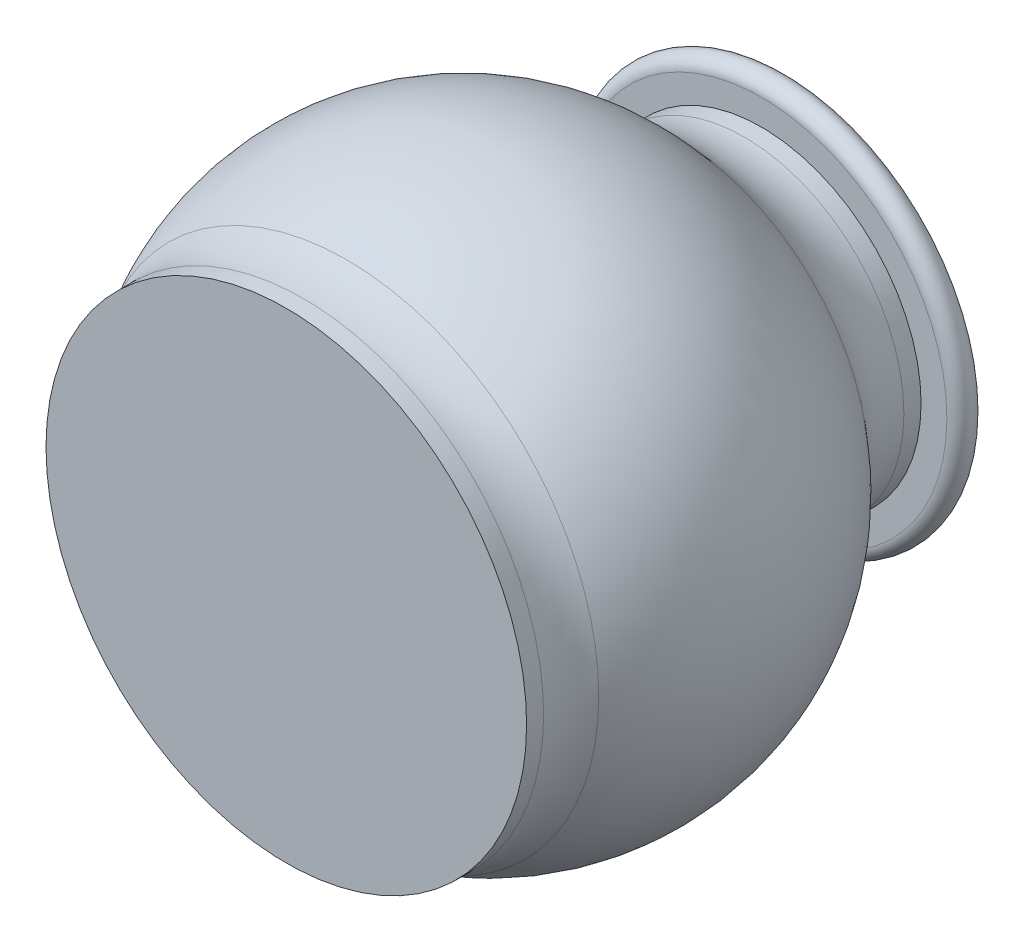
ISO-10303-21;
HEADER;
FILE_DESCRIPTION(('STEP AP214'),'2;1');
FILE_NAME('part.step','',(''),(''),'','','');
FILE_SCHEMA(('AUTOMOTIVE_DESIGN { 1 0 10303 214 1 1 1 1 }'));
ENDSEC;
DATA;
#1=APPLICATION_CONTEXT('core data for automotive mechanical design processes');
#2=APPLICATION_PROTOCOL_DEFINITION('international standard','automotive_design',2000,#1);
#3=PRODUCT_CONTEXT('',#1,'mechanical');
#4=PRODUCT('Part','Part','',(#3));
#5=PRODUCT_RELATED_PRODUCT_CATEGORY('part','',(#4));
#6=PRODUCT_DEFINITION_FORMATION('','',#4);
#7=PRODUCT_DEFINITION_CONTEXT('part definition',#1,'design');
#8=PRODUCT_DEFINITION('design','',#6,#7);
#9=PRODUCT_DEFINITION_SHAPE('','',#8);
#10=(LENGTH_UNIT() NAMED_UNIT(*) SI_UNIT(.MILLI.,.METRE.));
#11=(NAMED_UNIT(*) PLANE_ANGLE_UNIT() SI_UNIT($,.RADIAN.));
#12=(NAMED_UNIT(*) SI_UNIT($,.STERADIAN.) SOLID_ANGLE_UNIT());
#13=UNCERTAINTY_MEASURE_WITH_UNIT(LENGTH_MEASURE(1.E-05),#10,'distance_accuracy_value','');
#14=(GEOMETRIC_REPRESENTATION_CONTEXT(3) GLOBAL_UNCERTAINTY_ASSIGNED_CONTEXT((#13)) GLOBAL_UNIT_ASSIGNED_CONTEXT((#10,
#11,#12)) REPRESENTATION_CONTEXT('',''));
#15=CARTESIAN_POINT('',(0.,0.,0.));
#16=DIRECTION('',(0.,0.,1.));
#17=DIRECTION('',(1.,0.,0.));
#18=AXIS2_PLACEMENT_3D('',#15,#16,#17);
#19=CARTESIAN_POINT('',(0.,0.,0.));
#20=DIRECTION('',(0.,0.,-1.));
#21=DIRECTION('',(-1.,0.,0.));
#22=AXIS2_PLACEMENT_3D('',#19,#20,#21);
#23=PLANE('',#22);
#24=CARTESIAN_POINT('',(0.,0.,0.));
#25=DIRECTION('',(0.,0.,1.));
#26=DIRECTION('',(1.,0.,0.));
#27=AXIS2_PLACEMENT_3D('',#24,#25,#26);
#28=CIRCLE('',#27,27.9598500529972);
#29=CARTESIAN_POINT('',(27.9598500529972,0.,0.));
#30=VERTEX_POINT('',#29);
#31=EDGE_CURVE('E10',#30,#30,#28,.T.);
#32=ORIENTED_EDGE('',*,*,#31,.T.);
#33=EDGE_LOOP('',(#32));
#34=FACE_BOUND('',#33,.T.);
#35=ADVANCED_FACE('F39',(#34),#23,.F.);
#36=CARTESIAN_POINT('',(0.,0.,0.));
#37=DIRECTION('',(0.,0.,1.));
#38=DIRECTION('',(1.,0.,0.));
#39=AXIS2_PLACEMENT_3D('',#36,#37,#38);
#40=CYLINDRICAL_SURFACE('',#39,27.9598500529972);
#41=ORIENTED_EDGE('',*,*,#31,.F.);
#42=EDGE_LOOP('',(#41));
#43=FACE_BOUND('',#42,.T.);
#44=CARTESIAN_POINT('',(0.,0.,-1.97907561306958));
#45=DIRECTION('',(0.,0.,1.));
#46=DIRECTION('',(1.,0.,0.));
#47=AXIS2_PLACEMENT_3D('',#44,#45,#46);
#48=CIRCLE('',#47,27.9598500529972);
#49=CARTESIAN_POINT('',(27.9598500529972,0.,-1.97907561306958));
#50=VERTEX_POINT('',#49);
#51=EDGE_CURVE('E44',#50,#50,#48,.T.);
#52=ORIENTED_EDGE('',*,*,#51,.T.);
#53=EDGE_LOOP('',(#52));
#54=FACE_BOUND('',#53,.T.);
#55=ADVANCED_FACE('F98',(#43,#54),#40,.T.);
#56=CARTESIAN_POINT('',(0.,0.,-1.97907561306958));
#57=DIRECTION('',(0.,0.,1.));
#58=DIRECTION('',(1.,0.,0.));
#59=AXIS2_PLACEMENT_3D('',#56,#57,#58);
#60=TOROIDAL_SURFACE('',#59,37.9598500529972,10.);
#61=ORIENTED_EDGE('',*,*,#51,.F.);
#62=EDGE_LOOP('',(#61));
#63=FACE_BOUND('',#62,.T.);
#64=CARTESIAN_POINT('',(0.,0.,-7.02723095319795));
#65=DIRECTION('',(0.,0.,1.));
#66=DIRECTION('',(1.,0.,0.));
#67=AXIS2_PLACEMENT_3D('',#64,#65,#66);
#68=CIRCLE('',#67,29.3275776023656);
#69=CARTESIAN_POINT('',(29.3275776023656,0.,-7.02723095319795));
#70=VERTEX_POINT('',#69);
#71=EDGE_CURVE('E47',#70,#70,#68,.T.);
#72=ORIENTED_EDGE('',*,*,#71,.T.);
#73=EDGE_LOOP('',(#72));
#74=FACE_BOUND('',#73,.T.);
#75=ADVANCED_FACE('F105',(#63,#74),#60,.F.);
#76=CARTESIAN_POINT('',(0.,0.,-22.171696973583));
#77=DIRECTION('',(0.,0.,1.));
#78=DIRECTION('',(1.,0.,0.));
#79=AXIS2_PLACEMENT_3D('',#76,#77,#78);
#80=DEGENERATE_TOROIDAL_SURFACE('',#79,3.43076025047074,30.,.T.);
#81=ORIENTED_EDGE('',*,*,#71,.F.);
#82=EDGE_LOOP('',(#81));
#83=FACE_BOUND('',#82,.T.);
#84=CARTESIAN_POINT('',(0.,0.,-45.4981911098395));
#85=DIRECTION('',(0.,0.,1.));
#86=DIRECTION('',(1.,0.,0.));
#87=AXIS2_PLACEMENT_3D('',#84,#85,#86);
#88=CIRCLE('',#87,22.2954010186167);
#89=CARTESIAN_POINT('',(22.2954010186167,0.,-45.4981911098395));
#90=VERTEX_POINT('',#89);
#91=EDGE_CURVE('E52',#90,#90,#88,.T.);
#92=ORIENTED_EDGE('',*,*,#91,.T.);
#93=EDGE_LOOP('',(#92));
#94=FACE_BOUND('',#93,.T.);
#95=ADVANCED_FACE('F110',(#83,#94),#80,.T.);
#96=CARTESIAN_POINT('',(0.,0.,-53.2736891552583));
#97=DIRECTION('',(0.,0.,1.));
#98=DIRECTION('',(1.,0.,0.));
#99=AXIS2_PLACEMENT_3D('',#96,#97,#98);
#100=TOROIDAL_SURFACE('',#99,28.5836146079986,10.);
#101=ORIENTED_EDGE('',*,*,#91,.F.);
#102=EDGE_LOOP('',(#101));
#103=FACE_BOUND('',#102,.T.);
#104=CARTESIAN_POINT('',(0.,0.,-53.2736891552583));
#105=DIRECTION('',(0.,0.,1.));
#106=DIRECTION('',(1.,0.,0.));
#107=AXIS2_PLACEMENT_3D('',#104,#105,#106);
#108=CIRCLE('',#107,18.5836146079986);
#109=CARTESIAN_POINT('',(18.5836146079986,0.,-53.2736891552583));
#110=VERTEX_POINT('',#109);
#111=EDGE_CURVE('E59',#110,#110,#108,.T.);
#112=ORIENTED_EDGE('',*,*,#111,.T.);
#113=EDGE_LOOP('',(#112));
#114=FACE_BOUND('',#113,.T.);
#115=ADVANCED_FACE('F114',(#103,#114),#100,.F.);
#116=CARTESIAN_POINT('',(0.,0.,0.));
#117=DIRECTION('',(0.,0.,1.));
#118=DIRECTION('',(1.,0.,0.));
#119=AXIS2_PLACEMENT_3D('',#116,#117,#118);
#120=CYLINDRICAL_SURFACE('',#119,18.5836146079986);
#121=ORIENTED_EDGE('',*,*,#111,.F.);
#122=EDGE_LOOP('',(#121));
#123=FACE_BOUND('',#122,.T.);
#124=CARTESIAN_POINT('',(0.,0.,-55.2736891552583));
#125=DIRECTION('',(0.,0.,1.));
#126=DIRECTION('',(1.,0.,0.));
#127=AXIS2_PLACEMENT_3D('',#124,#125,#126);
#128=CIRCLE('',#127,18.5836146079986);
#129=CARTESIAN_POINT('',(18.5836146079986,0.,-55.2736891552583));
#130=VERTEX_POINT('',#129);
#131=EDGE_CURVE('E62',#130,#130,#128,.T.);
#132=ORIENTED_EDGE('',*,*,#131,.T.);
#133=EDGE_LOOP('',(#132));
#134=FACE_BOUND('',#133,.T.);
#135=ADVANCED_FACE('F120',(#123,#134),#120,.T.);
#136=CARTESIAN_POINT('',(-18.5836146079986,0.,-55.2736891552583));
#137=DIRECTION('',(0.,0.,-1.));
#138=DIRECTION('',(-1.,0.,0.));
#139=AXIS2_PLACEMENT_3D('',#136,#137,#138);
#140=PLANE('',#139);
#141=ORIENTED_EDGE('',*,*,#131,.F.);
#142=EDGE_LOOP('',(#141));
#143=FACE_BOUND('',#142,.T.);
#144=CARTESIAN_POINT('',(0.,0.,-55.2736891552583));
#145=DIRECTION('',(0.,0.,1.));
#146=DIRECTION('',(1.,0.,0.));
#147=AXIS2_PLACEMENT_3D('',#144,#145,#146);
#148=CIRCLE('',#147,21.5836146079986);
#149=CARTESIAN_POINT('',(21.5836146079986,0.,-55.2736891552583));
#150=VERTEX_POINT('',#149);
#151=EDGE_CURVE('E61',#150,#150,#148,.T.);
#152=ORIENTED_EDGE('',*,*,#151,.T.);
#153=EDGE_LOOP('',(#152));
#154=FACE_BOUND('',#153,.T.);
#155=ADVANCED_FACE('F121',(#143,#154),#140,.F.);
#156=CARTESIAN_POINT('',(0.,0.,-56.7736891552583));
#157=DIRECTION('',(0.,0.,1.));
#158=DIRECTION('',(1.,0.,0.));
#159=AXIS2_PLACEMENT_3D('',#156,#157,#158);
#160=TOROIDAL_SURFACE('',#159,21.5836146079986,1.5);
#161=ORIENTED_EDGE('',*,*,#151,.F.);
#162=EDGE_LOOP('',(#161));
#163=FACE_BOUND('',#162,.T.);
#164=CARTESIAN_POINT('',(0.,0.,-58.2736891552583));
#165=DIRECTION('',(0.,0.,1.));
#166=DIRECTION('',(1.,0.,0.));
#167=AXIS2_PLACEMENT_3D('',#164,#165,#166);
#168=CIRCLE('',#167,21.5836146079986);
#169=CARTESIAN_POINT('',(21.5836146079986,0.,-58.2736891552583));
#170=VERTEX_POINT('',#169);
#171=EDGE_CURVE('E67',#170,#170,#168,.T.);
#172=ORIENTED_EDGE('',*,*,#171,.T.);
#173=EDGE_LOOP('',(#172));
#174=FACE_BOUND('',#173,.T.);
#175=ADVANCED_FACE('F125',(#163,#174),#160,.T.);
#176=CARTESIAN_POINT('',(-15.5836146079986,0.,-58.2736891552583));
#177=DIRECTION('',(0.,0.,1.));
#178=DIRECTION('',(1.,0.,0.));
#179=AXIS2_PLACEMENT_3D('',#176,#177,#178);
#180=PLANE('',#179);
#181=ORIENTED_EDGE('',*,*,#171,.F.);
#182=EDGE_LOOP('',(#181));
#183=FACE_BOUND('',#182,.T.);
#184=CARTESIAN_POINT('',(0.,0.,-58.2736891552583));
#185=DIRECTION('',(0.,0.,1.));
#186=DIRECTION('',(1.,0.,0.));
#187=AXIS2_PLACEMENT_3D('',#184,#185,#186);
#188=CIRCLE('',#187,15.5836146079986);
#189=CARTESIAN_POINT('',(15.5836146079986,0.,-58.2736891552583));
#190=VERTEX_POINT('',#189);
#191=EDGE_CURVE('E70',#190,#190,#188,.T.);
#192=ORIENTED_EDGE('',*,*,#191,.T.);
#193=EDGE_LOOP('',(#192));
#194=FACE_BOUND('',#193,.T.);
#195=ADVANCED_FACE('F129',(#183,#194),#180,.F.);
#196=CARTESIAN_POINT('',(0.,0.,0.));
#197=DIRECTION('',(0.,0.,1.));
#198=DIRECTION('',(1.,0.,0.));
#199=AXIS2_PLACEMENT_3D('',#196,#197,#198);
#200=CYLINDRICAL_SURFACE('',#199,15.5836146079986);
#201=ORIENTED_EDGE('',*,*,#191,.F.);
#202=EDGE_LOOP('',(#201));
#203=FACE_BOUND('',#202,.T.);
#204=CARTESIAN_POINT('',(0.,0.,-53.2736891552583));
#205=DIRECTION('',(0.,0.,1.));
#206=DIRECTION('',(1.,0.,0.));
#207=AXIS2_PLACEMENT_3D('',#204,#205,#206);
#208=CIRCLE('',#207,15.5836146079986);
#209=CARTESIAN_POINT('',(15.5836146079986,0.,-53.2736891552583));
#210=VERTEX_POINT('',#209);
#211=EDGE_CURVE('E71',#210,#210,#208,.T.);
#212=ORIENTED_EDGE('',*,*,#211,.T.);
#213=EDGE_LOOP('',(#212));
#214=FACE_BOUND('',#213,.T.);
#215=ADVANCED_FACE('F134',(#203,#214),#200,.F.);
#216=CARTESIAN_POINT('',(0.,0.,-53.2736891552583));
#217=DIRECTION('',(0.,0.,1.));
#218=DIRECTION('',(1.,0.,0.));
#219=AXIS2_PLACEMENT_3D('',#216,#217,#218);
#220=TOROIDAL_SURFACE('',#219,28.5836146079986,13.);
#221=ORIENTED_EDGE('',*,*,#211,.F.);
#222=EDGE_LOOP('',(#221));
#223=FACE_BOUND('',#222,.T.);
#224=CARTESIAN_POINT('',(0.,0.,-43.1655416962139));
#225=DIRECTION('',(0.,0.,1.));
#226=DIRECTION('',(1.,0.,0.));
#227=AXIS2_PLACEMENT_3D('',#224,#225,#226);
#228=CIRCLE('',#227,20.4089369418021);
#229=CARTESIAN_POINT('',(20.4089369418021,0.,-43.1655416962139));
#230=VERTEX_POINT('',#229);
#231=EDGE_CURVE('E77',#230,#230,#228,.T.);
#232=ORIENTED_EDGE('',*,*,#231,.T.);
#233=EDGE_LOOP('',(#232));
#234=FACE_BOUND('',#233,.T.);
#235=ADVANCED_FACE('F137',(#223,#234),#220,.T.);
#236=CARTESIAN_POINT('',(0.,0.,-22.171696973583));
#237=DIRECTION('',(0.,0.,1.));
#238=DIRECTION('',(1.,0.,0.));
#239=AXIS2_PLACEMENT_3D('',#236,#237,#238);
#240=DEGENERATE_TOROIDAL_SURFACE('',#239,3.43076025047074,27.,.T.);
#241=ORIENTED_EDGE('',*,*,#231,.F.);
#242=EDGE_LOOP('',(#241));
#243=FACE_BOUND('',#242,.T.);
#244=CARTESIAN_POINT('',(0.,0.,-8.54167755523645));
#245=DIRECTION('',(0.,0.,1.));
#246=DIRECTION('',(1.,0.,0.));
#247=AXIS2_PLACEMENT_3D('',#244,#245,#246);
#248=CIRCLE('',#247,26.7378958671761);
#249=CARTESIAN_POINT('',(26.7378958671761,0.,-8.54167755523645));
#250=VERTEX_POINT('',#249);
#251=EDGE_CURVE('E76',#250,#250,#248,.T.);
#252=ORIENTED_EDGE('',*,*,#251,.T.);
#253=EDGE_LOOP('',(#252));
#254=FACE_BOUND('',#253,.T.);
#255=ADVANCED_FACE('F94',(#243,#254),#240,.F.);
#256=CARTESIAN_POINT('',(0.,0.,-1.97907561306958));
#257=DIRECTION('',(0.,0.,1.));
#258=DIRECTION('',(1.,0.,0.));
#259=AXIS2_PLACEMENT_3D('',#256,#257,#258);
#260=TOROIDAL_SURFACE('',#259,37.9598500529972,13.);
#261=ORIENTED_EDGE('',*,*,#251,.F.);
#262=EDGE_LOOP('',(#261));
#263=FACE_BOUND('',#262,.T.);
#264=CARTESIAN_POINT('',(0.,0.,-3.));
#265=DIRECTION('',(0.,0.,1.));
#266=DIRECTION('',(1.,0.,0.));
#267=AXIS2_PLACEMENT_3D('',#264,#265,#266);
#268=CIRCLE('',#267,25.);
#269=CARTESIAN_POINT('',(25.,0.,-3.));
#270=VERTEX_POINT('',#269);
#271=EDGE_CURVE('E82',#270,#270,#268,.T.);
#272=ORIENTED_EDGE('',*,*,#271,.T.);
#273=EDGE_LOOP('',(#272));
#274=FACE_BOUND('',#273,.T.);
#275=ADVANCED_FACE('F88',(#263,#274),#260,.T.);
#276=CARTESIAN_POINT('',(0.,0.,-3.));
#277=DIRECTION('',(0.,0.,1.));
#278=DIRECTION('',(1.,0.,0.));
#279=AXIS2_PLACEMENT_3D('',#276,#277,#278);
#280=PLANE('',#279);
#281=ORIENTED_EDGE('',*,*,#271,.F.);
#282=EDGE_LOOP('',(#281));
#283=FACE_BOUND('',#282,.T.);
#284=ADVANCED_FACE('F86',(#283),#280,.F.);
#285=CLOSED_SHELL('',(#35,#55,#75,#95,#115,#135,#155,#175,#195,#215,#235,#255,#275,#284));
#286=MANIFOLD_SOLID_BREP('B2',#285);
#287=ADVANCED_BREP_SHAPE_REPRESENTATION('',(#18,#286),#14);
#288=SHAPE_DEFINITION_REPRESENTATION(#9,#287);
ENDSEC;
END-ISO-10303-21;
